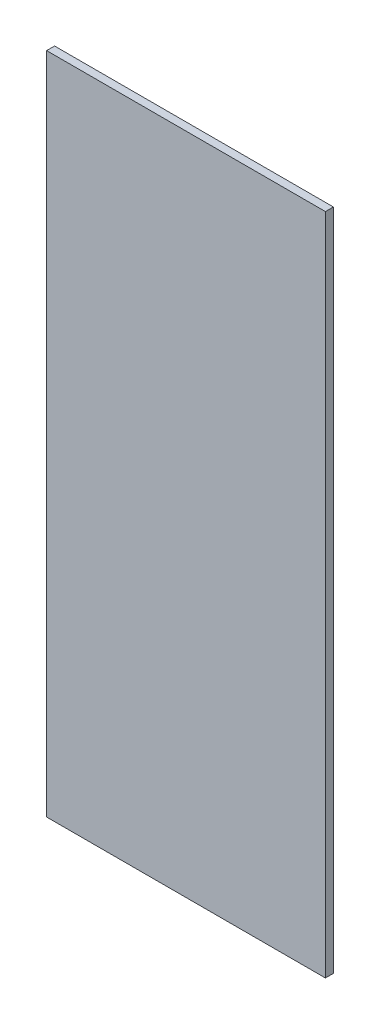
ISO-10303-21;
HEADER;
FILE_DESCRIPTION(('STEP AP214'),'2;1');
FILE_NAME('part.step','',(''),(''),'','','');
FILE_SCHEMA(('AUTOMOTIVE_DESIGN { 1 0 10303 214 1 1 1 1 }'));
ENDSEC;
DATA;
#1=APPLICATION_CONTEXT('core data for automotive mechanical design processes');
#2=APPLICATION_PROTOCOL_DEFINITION('international standard','automotive_design',2000,#1);
#3=PRODUCT_CONTEXT('',#1,'mechanical');
#4=PRODUCT('Part','Part','',(#3));
#5=PRODUCT_RELATED_PRODUCT_CATEGORY('part','',(#4));
#6=PRODUCT_DEFINITION_FORMATION('','',#4);
#7=PRODUCT_DEFINITION_CONTEXT('part definition',#1,'design');
#8=PRODUCT_DEFINITION('design','',#6,#7);
#9=PRODUCT_DEFINITION_SHAPE('','',#8);
#10=(LENGTH_UNIT() NAMED_UNIT(*) SI_UNIT(.MILLI.,.METRE.));
#11=(NAMED_UNIT(*) PLANE_ANGLE_UNIT() SI_UNIT($,.RADIAN.));
#12=(NAMED_UNIT(*) SI_UNIT($,.STERADIAN.) SOLID_ANGLE_UNIT());
#13=UNCERTAINTY_MEASURE_WITH_UNIT(LENGTH_MEASURE(1.E-05),#10,'distance_accuracy_value','');
#14=(GEOMETRIC_REPRESENTATION_CONTEXT(3) GLOBAL_UNCERTAINTY_ASSIGNED_CONTEXT((#13)) GLOBAL_UNIT_ASSIGNED_CONTEXT((#10,
#11,#12)) REPRESENTATION_CONTEXT('',''));
#15=CARTESIAN_POINT('',(0.,0.,0.));
#16=DIRECTION('',(0.,0.,1.));
#17=DIRECTION('',(1.,0.,0.));
#18=AXIS2_PLACEMENT_3D('',#15,#16,#17);
#19=CARTESIAN_POINT('',(0.,0.,3.));
#20=DIRECTION('',(1.,0.,0.));
#21=DIRECTION('',(0.,0.,-1.));
#22=AXIS2_PLACEMENT_3D('',#19,#20,#21);
#23=PLANE('',#22);
#24=DIRECTION('',(0.,-1.,0.));
#25=VECTOR('',#24,1.);
#26=CARTESIAN_POINT('',(0.,0.,0.));
#27=LINE('',#26,#25);
#28=CARTESIAN_POINT('',(0.,250.,0.));
#29=VERTEX_POINT('',#28);
#30=CARTESIAN_POINT('',(0.,0.,0.));
#31=VERTEX_POINT('',#30);
#32=EDGE_CURVE('E96',#29,#31,#27,.T.);
#33=ORIENTED_EDGE('',*,*,#32,.T.);
#34=DIRECTION('',(0.,0.,-1.));
#35=VECTOR('',#34,1.);
#36=CARTESIAN_POINT('',(0.,0.,3.));
#37=LINE('',#36,#35);
#38=CARTESIAN_POINT('',(0.,0.,3.));
#39=VERTEX_POINT('',#38);
#40=EDGE_CURVE('E11',#39,#31,#37,.T.);
#41=ORIENTED_EDGE('',*,*,#40,.F.);
#42=DIRECTION('',(0.,-1.,0.));
#43=VECTOR('',#42,1.);
#44=CARTESIAN_POINT('',(0.,0.,3.));
#45=LINE('',#44,#43);
#46=CARTESIAN_POINT('',(0.,250.,3.));
#47=VERTEX_POINT('',#46);
#48=EDGE_CURVE('E84',#47,#39,#45,.T.);
#49=ORIENTED_EDGE('',*,*,#48,.F.);
#50=DIRECTION('',(0.,0.,-1.));
#51=VECTOR('',#50,1.);
#52=CARTESIAN_POINT('',(0.,250.,3.));
#53=LINE('',#52,#51);
#54=EDGE_CURVE('E92',#47,#29,#53,.T.);
#55=ORIENTED_EDGE('',*,*,#54,.T.);
#56=EDGE_LOOP('',(#33,#41,#49,#55));
#57=FACE_BOUND('',#56,.T.);
#58=ADVANCED_FACE('F33',(#57),#23,.F.);
#59=CARTESIAN_POINT('',(0.,0.,3.));
#60=DIRECTION('',(0.,1.,0.));
#61=DIRECTION('',(0.,0.,1.));
#62=AXIS2_PLACEMENT_3D('',#59,#60,#61);
#63=PLANE('',#62);
#64=DIRECTION('',(1.,0.,0.));
#65=VECTOR('',#64,1.);
#66=CARTESIAN_POINT('',(0.,0.,0.));
#67=LINE('',#66,#65);
#68=CARTESIAN_POINT('',(105.,0.,0.));
#69=VERTEX_POINT('',#68);
#70=EDGE_CURVE('E88',#31,#69,#67,.T.);
#71=ORIENTED_EDGE('',*,*,#70,.T.);
#72=DIRECTION('',(0.,0.,-1.));
#73=VECTOR('',#72,1.);
#74=CARTESIAN_POINT('',(105.,0.,3.));
#75=LINE('',#74,#73);
#76=CARTESIAN_POINT('',(105.,0.,3.));
#77=VERTEX_POINT('',#76);
#78=EDGE_CURVE('E41',#77,#69,#75,.T.);
#79=ORIENTED_EDGE('',*,*,#78,.F.);
#80=DIRECTION('',(1.,0.,0.));
#81=VECTOR('',#80,1.);
#82=CARTESIAN_POINT('',(0.,0.,3.));
#83=LINE('',#82,#81);
#84=EDGE_CURVE('E79',#39,#77,#83,.T.);
#85=ORIENTED_EDGE('',*,*,#84,.F.);
#86=ORIENTED_EDGE('',*,*,#40,.T.);
#87=EDGE_LOOP('',(#71,#79,#85,#86));
#88=FACE_BOUND('',#87,.T.);
#89=ADVANCED_FACE('F87',(#88),#63,.F.);
#90=CARTESIAN_POINT('',(105.,0.,3.));
#91=DIRECTION('',(-1.,0.,0.));
#92=DIRECTION('',(0.,0.,1.));
#93=AXIS2_PLACEMENT_3D('',#90,#91,#92);
#94=PLANE('',#93);
#95=DIRECTION('',(0.,1.,0.));
#96=VECTOR('',#95,1.);
#97=CARTESIAN_POINT('',(105.,0.,0.));
#98=LINE('',#97,#96);
#99=CARTESIAN_POINT('',(105.,250.,0.));
#100=VERTEX_POINT('',#99);
#101=EDGE_CURVE('E66',#69,#100,#98,.T.);
#102=ORIENTED_EDGE('',*,*,#101,.T.);
#103=DIRECTION('',(0.,0.,-1.));
#104=VECTOR('',#103,1.);
#105=CARTESIAN_POINT('',(105.,250.,3.));
#106=LINE('',#105,#104);
#107=CARTESIAN_POINT('',(105.,250.,3.));
#108=VERTEX_POINT('',#107);
#109=EDGE_CURVE('E89',#108,#100,#106,.T.);
#110=ORIENTED_EDGE('',*,*,#109,.F.);
#111=DIRECTION('',(0.,1.,0.));
#112=VECTOR('',#111,1.);
#113=CARTESIAN_POINT('',(105.,0.,3.));
#114=LINE('',#113,#112);
#115=EDGE_CURVE('E82',#77,#108,#114,.T.);
#116=ORIENTED_EDGE('',*,*,#115,.F.);
#117=ORIENTED_EDGE('',*,*,#78,.T.);
#118=EDGE_LOOP('',(#102,#110,#116,#117));
#119=FACE_BOUND('',#118,.T.);
#120=ADVANCED_FACE('F90',(#119),#94,.F.);
#121=CARTESIAN_POINT('',(0.,250.,3.));
#122=DIRECTION('',(0.,-1.,0.));
#123=DIRECTION('',(0.,0.,-1.));
#124=AXIS2_PLACEMENT_3D('',#121,#122,#123);
#125=PLANE('',#124);
#126=DIRECTION('',(-1.,0.,0.));
#127=VECTOR('',#126,1.);
#128=CARTESIAN_POINT('',(0.,250.,0.));
#129=LINE('',#128,#127);
#130=EDGE_CURVE('E72',#100,#29,#129,.T.);
#131=ORIENTED_EDGE('',*,*,#130,.T.);
#132=ORIENTED_EDGE('',*,*,#54,.F.);
#133=DIRECTION('',(-1.,0.,0.));
#134=VECTOR('',#133,1.);
#135=CARTESIAN_POINT('',(0.,250.,3.));
#136=LINE('',#135,#134);
#137=EDGE_CURVE('E49',#108,#47,#136,.T.);
#138=ORIENTED_EDGE('',*,*,#137,.F.);
#139=ORIENTED_EDGE('',*,*,#109,.T.);
#140=EDGE_LOOP('',(#131,#132,#138,#139));
#141=FACE_BOUND('',#140,.T.);
#142=ADVANCED_FACE('F103',(#141),#125,.F.);
#143=CARTESIAN_POINT('',(0.,0.,3.));
#144=DIRECTION('',(0.,0.,-1.));
#145=DIRECTION('',(-1.,0.,0.));
#146=AXIS2_PLACEMENT_3D('',#143,#144,#145);
#147=PLANE('',#146);
#148=ORIENTED_EDGE('',*,*,#48,.T.);
#149=ORIENTED_EDGE('',*,*,#84,.T.);
#150=ORIENTED_EDGE('',*,*,#115,.T.);
#151=ORIENTED_EDGE('',*,*,#137,.T.);
#152=EDGE_LOOP('',(#148,#149,#150,#151));
#153=FACE_BOUND('',#152,.T.);
#154=ADVANCED_FACE('F80',(#153),#147,.F.);
#155=CARTESIAN_POINT('',(0.,0.,0.));
#156=DIRECTION('',(0.,0.,-1.));
#157=DIRECTION('',(-1.,0.,0.));
#158=AXIS2_PLACEMENT_3D('',#155,#156,#157);
#159=PLANE('',#158);
#160=ORIENTED_EDGE('',*,*,#32,.F.);
#161=ORIENTED_EDGE('',*,*,#130,.F.);
#162=ORIENTED_EDGE('',*,*,#101,.F.);
#163=ORIENTED_EDGE('',*,*,#70,.F.);
#164=EDGE_LOOP('',(#160,#161,#162,#163));
#165=FACE_BOUND('',#164,.T.);
#166=ADVANCED_FACE('F106',(#165),#159,.T.);
#167=CLOSED_SHELL('',(#58,#89,#120,#142,#154,#166));
#168=MANIFOLD_SOLID_BREP('B2',#167);
#169=ADVANCED_BREP_SHAPE_REPRESENTATION('',(#18,#168),#14);
#170=SHAPE_DEFINITION_REPRESENTATION(#9,#169);
ENDSEC;
END-ISO-10303-21;
